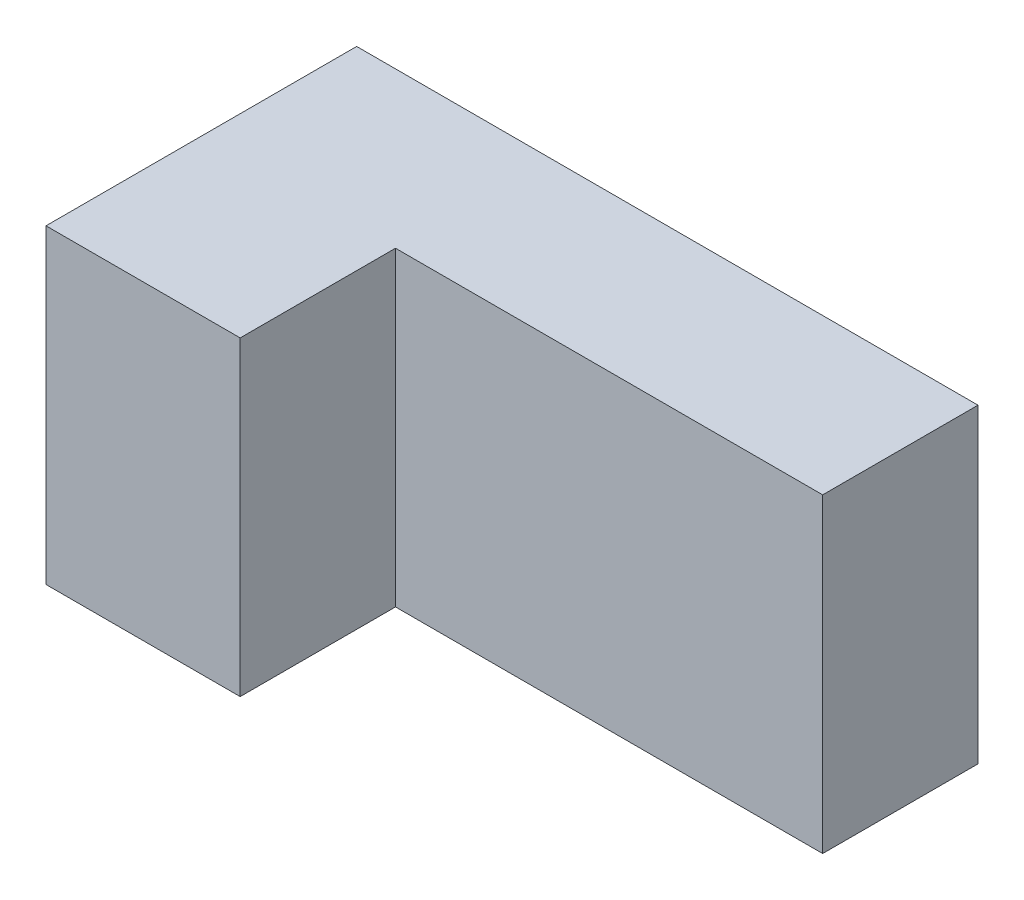
ISO-10303-21;
HEADER;
FILE_DESCRIPTION(('STEP AP214'),'2;1');
FILE_NAME('part.step','',(''),(''),'','','');
FILE_SCHEMA(('AUTOMOTIVE_DESIGN { 1 0 10303 214 1 1 1 1 }'));
ENDSEC;
DATA;
#1=APPLICATION_CONTEXT('core data for automotive mechanical design processes');
#2=APPLICATION_PROTOCOL_DEFINITION('international standard','automotive_design',2000,#1);
#3=PRODUCT_CONTEXT('',#1,'mechanical');
#4=PRODUCT('Part','Part','',(#3));
#5=PRODUCT_RELATED_PRODUCT_CATEGORY('part','',(#4));
#6=PRODUCT_DEFINITION_FORMATION('','',#4);
#7=PRODUCT_DEFINITION_CONTEXT('part definition',#1,'design');
#8=PRODUCT_DEFINITION('design','',#6,#7);
#9=PRODUCT_DEFINITION_SHAPE('','',#8);
#10=(LENGTH_UNIT() NAMED_UNIT(*) SI_UNIT(.MILLI.,.METRE.));
#11=(NAMED_UNIT(*) PLANE_ANGLE_UNIT() SI_UNIT($,.RADIAN.));
#12=(NAMED_UNIT(*) SI_UNIT($,.STERADIAN.) SOLID_ANGLE_UNIT());
#13=UNCERTAINTY_MEASURE_WITH_UNIT(LENGTH_MEASURE(1.E-05),#10,'distance_accuracy_value','');
#14=(GEOMETRIC_REPRESENTATION_CONTEXT(3) GLOBAL_UNCERTAINTY_ASSIGNED_CONTEXT((#13)) GLOBAL_UNIT_ASSIGNED_CONTEXT((#10,
#11,#12)) REPRESENTATION_CONTEXT('',''));
#15=CARTESIAN_POINT('',(0.,0.,0.));
#16=DIRECTION('',(0.,0.,1.));
#17=DIRECTION('',(1.,0.,0.));
#18=AXIS2_PLACEMENT_3D('',#15,#16,#17);
#19=CARTESIAN_POINT('',(0.,0.,20.));
#20=DIRECTION('',(0.,0.,-1.));
#21=DIRECTION('',(-1.,0.,0.));
#22=AXIS2_PLACEMENT_3D('',#19,#20,#21);
#23=PLANE('',#22);
#24=DIRECTION('',(0.,1.,0.));
#25=VECTOR('',#24,1.);
#26=CARTESIAN_POINT('',(-15.,20.,20.));
#27=LINE('',#26,#25);
#28=CARTESIAN_POINT('',(-15.,-20.,20.));
#29=VERTEX_POINT('',#28);
#30=CARTESIAN_POINT('',(-15.,20.,20.));
#31=VERTEX_POINT('',#30);
#32=EDGE_CURVE('E49',#29,#31,#27,.T.);
#33=ORIENTED_EDGE('',*,*,#32,.F.);
#34=DIRECTION('',(1.,0.,0.));
#35=VECTOR('',#34,1.);
#36=CARTESIAN_POINT('',(-40.,-20.,20.));
#37=LINE('',#36,#35);
#38=CARTESIAN_POINT('',(40.,-20.,20.));
#39=VERTEX_POINT('',#38);
#40=EDGE_CURVE('E54',#29,#39,#37,.T.);
#41=ORIENTED_EDGE('',*,*,#40,.T.);
#42=DIRECTION('',(0.,1.,0.));
#43=VECTOR('',#42,1.);
#44=CARTESIAN_POINT('',(40.,-20.,20.));
#45=LINE('',#44,#43);
#46=CARTESIAN_POINT('',(40.,20.,20.));
#47=VERTEX_POINT('',#46);
#48=EDGE_CURVE('E85',#39,#47,#45,.T.);
#49=ORIENTED_EDGE('',*,*,#48,.T.);
#50=DIRECTION('',(-1.,0.,0.));
#51=VECTOR('',#50,1.);
#52=CARTESIAN_POINT('',(-40.,20.,20.));
#53=LINE('',#52,#51);
#54=EDGE_CURVE('E136',#47,#31,#53,.T.);
#55=ORIENTED_EDGE('',*,*,#54,.T.);
#56=EDGE_LOOP('',(#33,#41,#49,#55));
#57=FACE_BOUND('',#56,.T.);
#58=ADVANCED_FACE('F34',(#57),#23,.F.);
#59=CARTESIAN_POINT('',(40.,-20.,20.));
#60=DIRECTION('',(-1.,0.,0.));
#61=DIRECTION('',(0.,0.,1.));
#62=AXIS2_PLACEMENT_3D('',#59,#60,#61);
#63=PLANE('',#62);
#64=DIRECTION('',(0.,1.,0.));
#65=VECTOR('',#64,1.);
#66=CARTESIAN_POINT('',(40.,-20.,0.));
#67=LINE('',#66,#65);
#68=CARTESIAN_POINT('',(40.,-20.,0.));
#69=VERTEX_POINT('',#68);
#70=CARTESIAN_POINT('',(40.,20.,0.));
#71=VERTEX_POINT('',#70);
#72=EDGE_CURVE('E91',#69,#71,#67,.T.);
#73=ORIENTED_EDGE('',*,*,#72,.T.);
#74=DIRECTION('',(0.,0.,-1.));
#75=VECTOR('',#74,1.);
#76=CARTESIAN_POINT('',(40.,20.,20.));
#77=LINE('',#76,#75);
#78=EDGE_CURVE('E11',#47,#71,#77,.T.);
#79=ORIENTED_EDGE('',*,*,#78,.F.);
#80=ORIENTED_EDGE('',*,*,#48,.F.);
#81=DIRECTION('',(0.,0.,-1.));
#82=VECTOR('',#81,1.);
#83=CARTESIAN_POINT('',(40.,-20.,20.));
#84=LINE('',#83,#82);
#85=EDGE_CURVE('E77',#39,#69,#84,.T.);
#86=ORIENTED_EDGE('',*,*,#85,.T.);
#87=EDGE_LOOP('',(#73,#79,#80,#86));
#88=FACE_BOUND('',#87,.T.);
#89=ADVANCED_FACE('F36',(#88),#63,.F.);
#90=CARTESIAN_POINT('',(-40.,20.,20.));
#91=DIRECTION('',(0.,-1.,0.));
#92=DIRECTION('',(0.,0.,-1.));
#93=AXIS2_PLACEMENT_3D('',#90,#91,#92);
#94=PLANE('',#93);
#95=DIRECTION('',(-1.,0.,0.));
#96=VECTOR('',#95,1.);
#97=CARTESIAN_POINT('',(-40.,20.,0.));
#98=LINE('',#97,#96);
#99=CARTESIAN_POINT('',(-40.,20.,0.));
#100=VERTEX_POINT('',#99);
#101=EDGE_CURVE('E94',#71,#100,#98,.T.);
#102=ORIENTED_EDGE('',*,*,#101,.T.);
#103=DIRECTION('',(0.,0.,-1.));
#104=VECTOR('',#103,1.);
#105=CARTESIAN_POINT('',(-40.,20.,20.));
#106=LINE('',#105,#104);
#107=CARTESIAN_POINT('',(-40.,20.,40.));
#108=VERTEX_POINT('',#107);
#109=EDGE_CURVE('E42',#108,#100,#106,.T.);
#110=ORIENTED_EDGE('',*,*,#109,.F.);
#111=DIRECTION('',(-1.,0.,0.));
#112=VECTOR('',#111,1.);
#113=CARTESIAN_POINT('',(-40.,20.,40.));
#114=LINE('',#113,#112);
#115=CARTESIAN_POINT('',(-15.,20.,40.));
#116=VERTEX_POINT('',#115);
#117=EDGE_CURVE('E118',#116,#108,#114,.T.);
#118=ORIENTED_EDGE('',*,*,#117,.F.);
#119=DIRECTION('',(0.,0.,-1.));
#120=VECTOR('',#119,1.);
#121=CARTESIAN_POINT('',(-15.,20.,40.));
#122=LINE('',#121,#120);
#123=EDGE_CURVE('E99',#116,#31,#122,.T.);
#124=ORIENTED_EDGE('',*,*,#123,.T.);
#125=ORIENTED_EDGE('',*,*,#54,.F.);
#126=ORIENTED_EDGE('',*,*,#78,.T.);
#127=EDGE_LOOP('',(#102,#110,#118,#124,#125,#126));
#128=FACE_BOUND('',#127,.T.);
#129=ADVANCED_FACE('F115',(#128),#94,.F.);
#130=CARTESIAN_POINT('',(-40.,-20.,20.));
#131=DIRECTION('',(1.,0.,0.));
#132=DIRECTION('',(0.,0.,-1.));
#133=AXIS2_PLACEMENT_3D('',#130,#131,#132);
#134=PLANE('',#133);
#135=CARTESIAN_POINT('',(-40.,0.,21.8582342575515));
#136=DIRECTION('',(-1.,0.,0.));
#137=DIRECTION('',(0.,0.,1.));
#138=AXIS2_PLACEMENT_3D('',#135,#136,#137);
#139=CIRCLE('',#138,9.55930050977688);
#140=CARTESIAN_POINT('',(-40.,0.,31.4175347673284));
#141=VERTEX_POINT('',#140);
#142=EDGE_CURVE('E147',#141,#141,#139,.T.);
#143=ORIENTED_EDGE('',*,*,#142,.F.);
#144=EDGE_LOOP('',(#143));
#145=FACE_BOUND('',#144,.T.);
#146=DIRECTION('',(0.,-1.,0.));
#147=VECTOR('',#146,1.);
#148=CARTESIAN_POINT('',(-40.,-20.,0.));
#149=LINE('',#148,#147);
#150=CARTESIAN_POINT('',(-40.,-20.,0.));
#151=VERTEX_POINT('',#150);
#152=EDGE_CURVE('E86',#100,#151,#149,.T.);
#153=ORIENTED_EDGE('',*,*,#152,.T.);
#154=DIRECTION('',(0.,0.,-1.));
#155=VECTOR('',#154,1.);
#156=CARTESIAN_POINT('',(-40.,-20.,20.));
#157=LINE('',#156,#155);
#158=CARTESIAN_POINT('',(-40.,-20.,40.));
#159=VERTEX_POINT('',#158);
#160=EDGE_CURVE('E81',#159,#151,#157,.T.);
#161=ORIENTED_EDGE('',*,*,#160,.F.);
#162=DIRECTION('',(0.,-1.,0.));
#163=VECTOR('',#162,1.);
#164=CARTESIAN_POINT('',(-40.,20.,40.));
#165=LINE('',#164,#163);
#166=EDGE_CURVE('E111',#108,#159,#165,.T.);
#167=ORIENTED_EDGE('',*,*,#166,.F.);
#168=ORIENTED_EDGE('',*,*,#109,.T.);
#169=EDGE_LOOP('',(#153,#161,#167,#168));
#170=FACE_BOUND('',#169,.T.);
#171=ADVANCED_FACE('F109',(#145,#170),#134,.F.);
#172=CARTESIAN_POINT('',(-40.,-20.,20.));
#173=DIRECTION('',(0.,1.,0.));
#174=DIRECTION('',(0.,0.,1.));
#175=AXIS2_PLACEMENT_3D('',#172,#173,#174);
#176=PLANE('',#175);
#177=DIRECTION('',(1.,0.,0.));
#178=VECTOR('',#177,1.);
#179=CARTESIAN_POINT('',(-40.,-20.,0.));
#180=LINE('',#179,#178);
#181=EDGE_CURVE('E74',#151,#69,#180,.T.);
#182=ORIENTED_EDGE('',*,*,#181,.T.);
#183=ORIENTED_EDGE('',*,*,#85,.F.);
#184=ORIENTED_EDGE('',*,*,#40,.F.);
#185=DIRECTION('',(0.,0.,-1.));
#186=VECTOR('',#185,1.);
#187=CARTESIAN_POINT('',(-15.,-20.,40.));
#188=LINE('',#187,#186);
#189=CARTESIAN_POINT('',(-15.,-20.,40.));
#190=VERTEX_POINT('',#189);
#191=EDGE_CURVE('E95',#190,#29,#188,.T.);
#192=ORIENTED_EDGE('',*,*,#191,.F.);
#193=DIRECTION('',(1.,0.,0.));
#194=VECTOR('',#193,1.);
#195=CARTESIAN_POINT('',(-40.,-20.,40.));
#196=LINE('',#195,#194);
#197=EDGE_CURVE('E130',#159,#190,#196,.T.);
#198=ORIENTED_EDGE('',*,*,#197,.F.);
#199=ORIENTED_EDGE('',*,*,#160,.T.);
#200=EDGE_LOOP('',(#182,#183,#184,#192,#198,#199));
#201=FACE_BOUND('',#200,.T.);
#202=ADVANCED_FACE('F76',(#201),#176,.F.);
#203=CARTESIAN_POINT('',(0.,0.,0.));
#204=DIRECTION('',(0.,0.,-1.));
#205=DIRECTION('',(-1.,0.,0.));
#206=AXIS2_PLACEMENT_3D('',#203,#204,#205);
#207=PLANE('',#206);
#208=ORIENTED_EDGE('',*,*,#72,.F.);
#209=ORIENTED_EDGE('',*,*,#181,.F.);
#210=ORIENTED_EDGE('',*,*,#152,.F.);
#211=ORIENTED_EDGE('',*,*,#101,.F.);
#212=EDGE_LOOP('',(#208,#209,#210,#211));
#213=FACE_BOUND('',#212,.T.);
#214=ADVANCED_FACE('F93',(#213),#207,.T.);
#215=CARTESIAN_POINT('',(-15.,20.,40.));
#216=DIRECTION('',(-1.,0.,0.));
#217=DIRECTION('',(0.,-1.,0.));
#218=AXIS2_PLACEMENT_3D('',#215,#216,#217);
#219=PLANE('',#218);
#220=ORIENTED_EDGE('',*,*,#32,.T.);
#221=ORIENTED_EDGE('',*,*,#123,.F.);
#222=DIRECTION('',(0.,1.,0.));
#223=VECTOR('',#222,1.);
#224=CARTESIAN_POINT('',(-15.,20.,40.));
#225=LINE('',#224,#223);
#226=EDGE_CURVE('E126',#190,#116,#225,.T.);
#227=ORIENTED_EDGE('',*,*,#226,.F.);
#228=ORIENTED_EDGE('',*,*,#191,.T.);
#229=EDGE_LOOP('',(#220,#221,#227,#228));
#230=FACE_BOUND('',#229,.T.);
#231=ADVANCED_FACE('F139',(#230),#219,.F.);
#232=CARTESIAN_POINT('',(0.,0.,40.));
#233=DIRECTION('',(0.,0.,1.));
#234=DIRECTION('',(1.,0.,0.));
#235=AXIS2_PLACEMENT_3D('',#232,#233,#234);
#236=PLANE('',#235);
#237=ORIENTED_EDGE('',*,*,#166,.T.);
#238=ORIENTED_EDGE('',*,*,#197,.T.);
#239=ORIENTED_EDGE('',*,*,#226,.T.);
#240=ORIENTED_EDGE('',*,*,#117,.T.);
#241=EDGE_LOOP('',(#237,#238,#239,#240));
#242=FACE_BOUND('',#241,.T.);
#243=ADVANCED_FACE('F122',(#242),#236,.T.);
#244=CARTESIAN_POINT('',(-35.,0.,21.8582342575515));
#245=DIRECTION('',(-1.,0.,0.));
#246=DIRECTION('',(0.,0.,1.));
#247=AXIS2_PLACEMENT_3D('',#244,#245,#246);
#248=CYLINDRICAL_SURFACE('',#247,9.55930050977688);
#249=CARTESIAN_POINT('',(-35.,0.,21.8582342575515));
#250=DIRECTION('',(-1.,0.,0.));
#251=DIRECTION('',(0.,0.,1.));
#252=AXIS2_PLACEMENT_3D('',#249,#250,#251);
#253=CIRCLE('',#252,9.55930050977688);
#254=CARTESIAN_POINT('',(-35.,0.,31.4175347673284));
#255=VERTEX_POINT('',#254);
#256=EDGE_CURVE('E134',#255,#255,#253,.T.);
#257=ORIENTED_EDGE('',*,*,#256,.F.);
#258=EDGE_LOOP('',(#257));
#259=FACE_BOUND('',#258,.T.);
#260=ORIENTED_EDGE('',*,*,#142,.T.);
#261=EDGE_LOOP('',(#260));
#262=FACE_BOUND('',#261,.T.);
#263=ADVANCED_FACE('F155',(#259,#262),#248,.F.);
#264=CARTESIAN_POINT('',(-35.,0.,21.8582342575515));
#265=DIRECTION('',(-1.,0.,0.));
#266=DIRECTION('',(0.,0.,1.));
#267=AXIS2_PLACEMENT_3D('',#264,#265,#266);
#268=PLANE('',#267);
#269=ORIENTED_EDGE('',*,*,#256,.T.);
#270=EDGE_LOOP('',(#269));
#271=FACE_BOUND('',#270,.T.);
#272=ADVANCED_FACE('F153',(#271),#268,.T.);
#273=CLOSED_SHELL('',(#58,#89,#129,#171,#202,#214,#231,#243,#263,#272));
#274=MANIFOLD_SOLID_BREP('B2',#273);
#275=ADVANCED_BREP_SHAPE_REPRESENTATION('',(#18,#274),#14);
#276=SHAPE_DEFINITION_REPRESENTATION(#9,#275);
ENDSEC;
END-ISO-10303-21;
